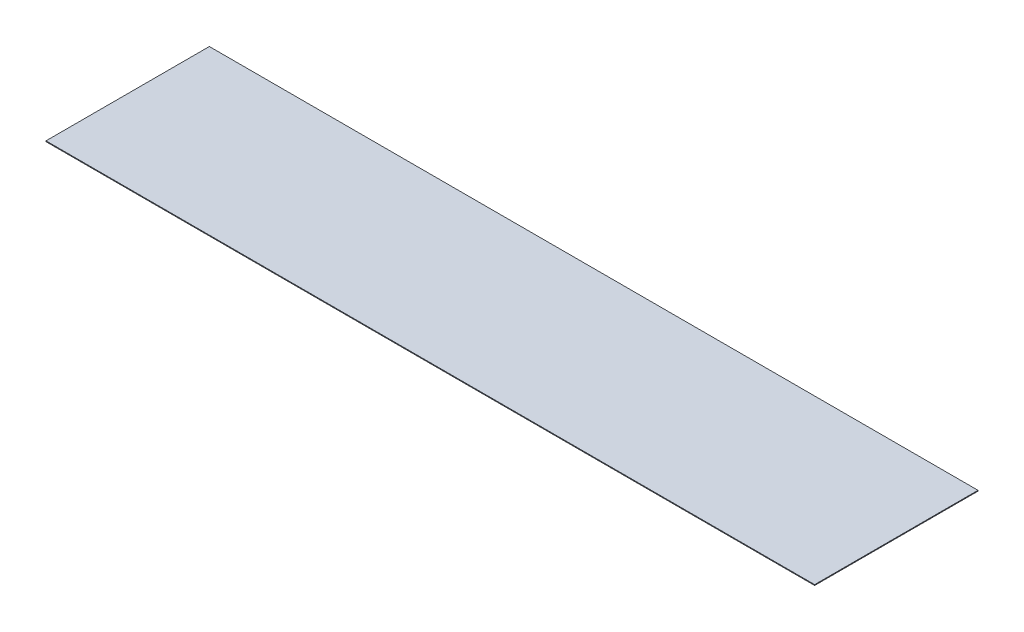
ISO-10303-21;
HEADER;
FILE_DESCRIPTION(('STEP AP214'),'2;1');
FILE_NAME('part.step','',(''),(''),'','','');
FILE_SCHEMA(('AUTOMOTIVE_DESIGN { 1 0 10303 214 1 1 1 1 }'));
ENDSEC;
DATA;
#1=APPLICATION_CONTEXT('core data for automotive mechanical design processes');
#2=APPLICATION_PROTOCOL_DEFINITION('international standard','automotive_design',2000,#1);
#3=PRODUCT_CONTEXT('',#1,'mechanical');
#4=PRODUCT('Part','Part','',(#3));
#5=PRODUCT_RELATED_PRODUCT_CATEGORY('part','',(#4));
#6=PRODUCT_DEFINITION_FORMATION('','',#4);
#7=PRODUCT_DEFINITION_CONTEXT('part definition',#1,'design');
#8=PRODUCT_DEFINITION('design','',#6,#7);
#9=PRODUCT_DEFINITION_SHAPE('','',#8);
#10=(LENGTH_UNIT() NAMED_UNIT(*) SI_UNIT(.MILLI.,.METRE.));
#11=(NAMED_UNIT(*) PLANE_ANGLE_UNIT() SI_UNIT($,.RADIAN.));
#12=(NAMED_UNIT(*) SI_UNIT($,.STERADIAN.) SOLID_ANGLE_UNIT());
#13=UNCERTAINTY_MEASURE_WITH_UNIT(LENGTH_MEASURE(1.E-05),#10,'distance_accuracy_value','');
#14=(GEOMETRIC_REPRESENTATION_CONTEXT(3) GLOBAL_UNCERTAINTY_ASSIGNED_CONTEXT((#13)) GLOBAL_UNIT_ASSIGNED_CONTEXT((#10,
#11,#12)) REPRESENTATION_CONTEXT('',''));
#15=CARTESIAN_POINT('',(0.,0.,0.));
#16=DIRECTION('',(0.,0.,1.));
#17=DIRECTION('',(1.,0.,0.));
#18=AXIS2_PLACEMENT_3D('',#15,#16,#17);
#19=CARTESIAN_POINT('',(-500.,1.,-106.25));
#20=DIRECTION('',(1.,0.,0.));
#21=DIRECTION('',(0.,0.,-1.));
#22=AXIS2_PLACEMENT_3D('',#19,#20,#21);
#23=PLANE('',#22);
#24=DIRECTION('',(0.,0.,1.));
#25=VECTOR('',#24,1.);
#26=CARTESIAN_POINT('',(-500.,0.,-106.25));
#27=LINE('',#26,#25);
#28=CARTESIAN_POINT('',(-500.,0.,-106.25));
#29=VERTEX_POINT('',#28);
#30=CARTESIAN_POINT('',(-500.,0.,106.25));
#31=VERTEX_POINT('',#30);
#32=EDGE_CURVE('E113',#29,#31,#27,.T.);
#33=ORIENTED_EDGE('',*,*,#32,.T.);
#34=DIRECTION('',(0.,-1.,0.));
#35=VECTOR('',#34,1.);
#36=CARTESIAN_POINT('',(-500.,1.,106.25));
#37=LINE('',#36,#35);
#38=CARTESIAN_POINT('',(-500.,1.,106.25));
#39=VERTEX_POINT('',#38);
#40=EDGE_CURVE('E11',#39,#31,#37,.T.);
#41=ORIENTED_EDGE('',*,*,#40,.F.);
#42=DIRECTION('',(0.,0.,1.));
#43=VECTOR('',#42,1.);
#44=CARTESIAN_POINT('',(-500.,1.,-106.25));
#45=LINE('',#44,#43);
#46=CARTESIAN_POINT('',(-500.,1.,-106.25));
#47=VERTEX_POINT('',#46);
#48=EDGE_CURVE('E97',#47,#39,#45,.T.);
#49=ORIENTED_EDGE('',*,*,#48,.F.);
#50=DIRECTION('',(0.,-1.,0.));
#51=VECTOR('',#50,1.);
#52=CARTESIAN_POINT('',(-500.,1.,-106.25));
#53=LINE('',#52,#51);
#54=EDGE_CURVE('E109',#47,#29,#53,.T.);
#55=ORIENTED_EDGE('',*,*,#54,.T.);
#56=EDGE_LOOP('',(#33,#41,#49,#55));
#57=FACE_BOUND('',#56,.T.);
#58=ADVANCED_FACE('F45',(#57),#23,.F.);
#59=CARTESIAN_POINT('',(500.,1.,106.25));
#60=DIRECTION('',(0.,0.,-1.));
#61=DIRECTION('',(-1.,0.,0.));
#62=AXIS2_PLACEMENT_3D('',#59,#60,#61);
#63=PLANE('',#62);
#64=DIRECTION('',(1.,0.,0.));
#65=VECTOR('',#64,1.);
#66=CARTESIAN_POINT('',(500.,0.,106.25));
#67=LINE('',#66,#65);
#68=CARTESIAN_POINT('',(500.,0.,106.25));
#69=VERTEX_POINT('',#68);
#70=EDGE_CURVE('E102',#31,#69,#67,.T.);
#71=ORIENTED_EDGE('',*,*,#70,.T.);
#72=DIRECTION('',(0.,-1.,0.));
#73=VECTOR('',#72,1.);
#74=CARTESIAN_POINT('',(500.,1.,106.25));
#75=LINE('',#74,#73);
#76=CARTESIAN_POINT('',(500.,1.,106.25));
#77=VERTEX_POINT('',#76);
#78=EDGE_CURVE('E54',#77,#69,#75,.T.);
#79=ORIENTED_EDGE('',*,*,#78,.F.);
#80=DIRECTION('',(1.,0.,0.));
#81=VECTOR('',#80,1.);
#82=CARTESIAN_POINT('',(500.,1.,106.25));
#83=LINE('',#82,#81);
#84=EDGE_CURVE('E92',#39,#77,#83,.T.);
#85=ORIENTED_EDGE('',*,*,#84,.F.);
#86=ORIENTED_EDGE('',*,*,#40,.T.);
#87=EDGE_LOOP('',(#71,#79,#85,#86));
#88=FACE_BOUND('',#87,.T.);
#89=ADVANCED_FACE('F101',(#88),#63,.F.);
#90=CARTESIAN_POINT('',(500.,1.,-106.25));
#91=DIRECTION('',(-1.,0.,0.));
#92=DIRECTION('',(0.,0.,1.));
#93=AXIS2_PLACEMENT_3D('',#90,#91,#92);
#94=PLANE('',#93);
#95=DIRECTION('',(0.,0.,-1.));
#96=VECTOR('',#95,1.);
#97=CARTESIAN_POINT('',(500.,0.,-106.25));
#98=LINE('',#97,#96);
#99=CARTESIAN_POINT('',(500.,0.,-106.25));
#100=VERTEX_POINT('',#99);
#101=EDGE_CURVE('E79',#69,#100,#98,.T.);
#102=ORIENTED_EDGE('',*,*,#101,.T.);
#103=DIRECTION('',(0.,-1.,0.));
#104=VECTOR('',#103,1.);
#105=CARTESIAN_POINT('',(500.,1.,-106.25));
#106=LINE('',#105,#104);
#107=CARTESIAN_POINT('',(500.,1.,-106.25));
#108=VERTEX_POINT('',#107);
#109=EDGE_CURVE('E104',#108,#100,#106,.T.);
#110=ORIENTED_EDGE('',*,*,#109,.F.);
#111=DIRECTION('',(0.,0.,-1.));
#112=VECTOR('',#111,1.);
#113=CARTESIAN_POINT('',(500.,1.,-106.25));
#114=LINE('',#113,#112);
#115=EDGE_CURVE('E95',#77,#108,#114,.T.);
#116=ORIENTED_EDGE('',*,*,#115,.F.);
#117=ORIENTED_EDGE('',*,*,#78,.T.);
#118=EDGE_LOOP('',(#102,#110,#116,#117));
#119=FACE_BOUND('',#118,.T.);
#120=ADVANCED_FACE('F105',(#119),#94,.F.);
#121=CARTESIAN_POINT('',(500.,1.,-106.25));
#122=DIRECTION('',(0.,0.,1.));
#123=DIRECTION('',(1.,0.,0.));
#124=AXIS2_PLACEMENT_3D('',#121,#122,#123);
#125=PLANE('',#124);
#126=DIRECTION('',(-1.,0.,0.));
#127=VECTOR('',#126,1.);
#128=CARTESIAN_POINT('',(500.,0.,-106.25));
#129=LINE('',#128,#127);
#130=EDGE_CURVE('E85',#100,#29,#129,.T.);
#131=ORIENTED_EDGE('',*,*,#130,.T.);
#132=ORIENTED_EDGE('',*,*,#54,.F.);
#133=DIRECTION('',(-1.,0.,0.));
#134=VECTOR('',#133,1.);
#135=CARTESIAN_POINT('',(500.,1.,-106.25));
#136=LINE('',#135,#134);
#137=EDGE_CURVE('E62',#108,#47,#136,.T.);
#138=ORIENTED_EDGE('',*,*,#137,.F.);
#139=ORIENTED_EDGE('',*,*,#109,.T.);
#140=EDGE_LOOP('',(#131,#132,#138,#139));
#141=FACE_BOUND('',#140,.T.);
#142=ADVANCED_FACE('F126',(#141),#125,.F.);
#143=CARTESIAN_POINT('',(0.,1.,0.));
#144=DIRECTION('',(0.,-1.,0.));
#145=DIRECTION('',(0.,0.,-1.));
#146=AXIS2_PLACEMENT_3D('',#143,#144,#145);
#147=PLANE('',#146);
#148=ORIENTED_EDGE('',*,*,#48,.T.);
#149=ORIENTED_EDGE('',*,*,#84,.T.);
#150=ORIENTED_EDGE('',*,*,#115,.T.);
#151=ORIENTED_EDGE('',*,*,#137,.T.);
#152=EDGE_LOOP('',(#148,#149,#150,#151));
#153=FACE_BOUND('',#152,.T.);
#154=ADVANCED_FACE('F93',(#153),#147,.F.);
#155=CARTESIAN_POINT('',(0.,0.,0.));
#156=DIRECTION('',(0.,-1.,0.));
#157=DIRECTION('',(0.,0.,-1.));
#158=AXIS2_PLACEMENT_3D('',#155,#156,#157);
#159=PLANE('',#158);
#160=ORIENTED_EDGE('',*,*,#32,.F.);
#161=ORIENTED_EDGE('',*,*,#130,.F.);
#162=ORIENTED_EDGE('',*,*,#101,.F.);
#163=ORIENTED_EDGE('',*,*,#70,.F.);
#164=EDGE_LOOP('',(#160,#161,#162,#163));
#165=FACE_BOUND('',#164,.T.);
#166=ADVANCED_FACE('F129',(#165),#159,.T.);
#167=CLOSED_SHELL('',(#58,#89,#120,#142,#154,#166));
#168=MANIFOLD_SOLID_BREP('B2',#167);
#169=ADVANCED_BREP_SHAPE_REPRESENTATION('',(#18,#168),#14);
#170=SHAPE_DEFINITION_REPRESENTATION(#9,#169);
ENDSEC;
END-ISO-10303-21;
